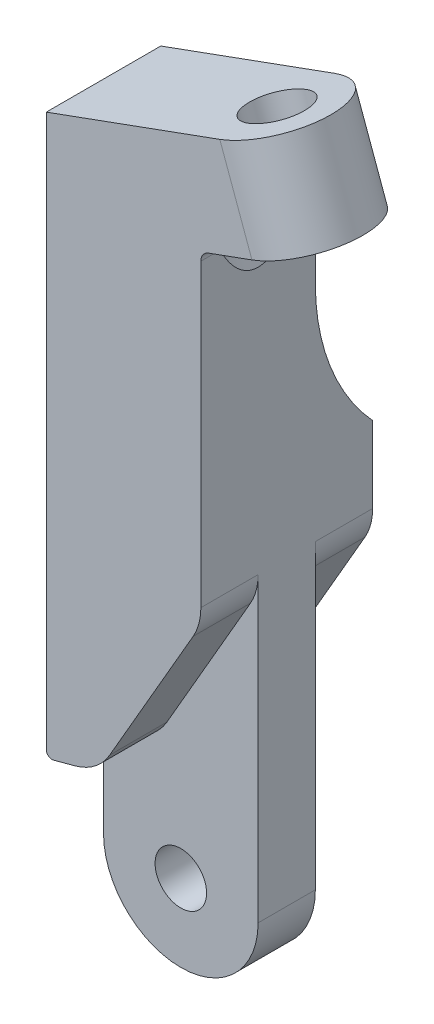
ISO-10303-21;
HEADER;
FILE_DESCRIPTION(('STEP AP214'),'2;1');
FILE_NAME('part.step','',(''),(''),'','','');
FILE_SCHEMA(('AUTOMOTIVE_DESIGN { 1 0 10303 214 1 1 1 1 }'));
ENDSEC;
DATA;
#1=APPLICATION_CONTEXT('core data for automotive mechanical design processes');
#2=APPLICATION_PROTOCOL_DEFINITION('international standard','automotive_design',2000,#1);
#3=PRODUCT_CONTEXT('',#1,'mechanical');
#4=PRODUCT('Part','Part','',(#3));
#5=PRODUCT_RELATED_PRODUCT_CATEGORY('part','',(#4));
#6=PRODUCT_DEFINITION_FORMATION('','',#4);
#7=PRODUCT_DEFINITION_CONTEXT('part definition',#1,'design');
#8=PRODUCT_DEFINITION('design','',#6,#7);
#9=PRODUCT_DEFINITION_SHAPE('','',#8);
#10=(LENGTH_UNIT() NAMED_UNIT(*) SI_UNIT(.MILLI.,.METRE.));
#11=(NAMED_UNIT(*) PLANE_ANGLE_UNIT() SI_UNIT($,.RADIAN.));
#12=(NAMED_UNIT(*) SI_UNIT($,.STERADIAN.) SOLID_ANGLE_UNIT());
#13=UNCERTAINTY_MEASURE_WITH_UNIT(LENGTH_MEASURE(1.E-05),#10,'distance_accuracy_value','');
#14=(GEOMETRIC_REPRESENTATION_CONTEXT(3) GLOBAL_UNCERTAINTY_ASSIGNED_CONTEXT((#13)) GLOBAL_UNIT_ASSIGNED_CONTEXT((#10,
#11,#12)) REPRESENTATION_CONTEXT('',''));
#15=CARTESIAN_POINT('',(0.,0.,0.));
#16=DIRECTION('',(0.,0.,1.));
#17=DIRECTION('',(1.,0.,0.));
#18=AXIS2_PLACEMENT_3D('',#15,#16,#17);
#19=CARTESIAN_POINT('',(7.74999998813417,52.5497924736561,-32.7119853821203));
#20=DIRECTION('',(0.,0.,1.));
#21=DIRECTION('',(1.,0.,0.));
#22=AXIS2_PLACEMENT_3D('',#19,#20,#21);
#23=CYLINDRICAL_SURFACE('',#22,1.);
#24=CARTESIAN_POINT('',(6.74999998813417,52.5497924736561,-0.833415067240527));
#25=CARTESIAN_POINT('',(6.7500121259237,52.5801881055409,-0.848996346004011));
#26=CARTESIAN_POINT('',(6.75138532953765,52.6098132825764,-0.865929051600248));
#27=CARTESIAN_POINT('',(6.75652244711346,52.6674473197246,-0.901856011982591));
#28=CARTESIAN_POINT('',(6.76027864759318,52.6954610778992,-0.920843451968727));
#29=CARTESIAN_POINT('',(6.76981116623183,52.7497451059245,-0.96016730730305));
#30=CARTESIAN_POINT('',(6.77556885288268,52.7760288846872,-0.980489925414612));
#31=CARTESIAN_POINT('',(6.78889147869522,52.8272288596915,-1.02227969994567));
#32=CARTESIAN_POINT('',(6.79645835456583,52.8521435549584,-1.04374806360577));
#33=CARTESIAN_POINT('',(6.81706092657832,52.9117677614023,-1.0975468507032));
#34=CARTESIAN_POINT('',(6.83101409580388,52.9457371950115,-1.13034887720623));
#35=CARTESIAN_POINT('',(6.86200385507355,53.0110618209416,-1.19709522197321));
#36=CARTESIAN_POINT('',(6.87904319408747,53.0424146458819,-1.23104053648487));
#37=CARTESIAN_POINT('',(6.93468580892116,53.1331738362366,-1.33441242655575));
#38=CARTESIAN_POINT('',(6.9776369454426,53.188794590026,-1.40491920946501));
#39=CARTESIAN_POINT('',(7.05195280838462,53.2668519845086,-1.51404942511004));
#40=CARTESIAN_POINT('',(7.07974464497137,53.2929023776563,-1.55263851979391));
#41=CARTESIAN_POINT('',(7.13830036682305,53.3418019363935,-1.62960848721527));
#42=CARTESIAN_POINT('',(7.16906386461265,53.3646515183877,-1.66798938641198));
#43=CARTESIAN_POINT('',(7.23300195249108,53.4066214512343,-1.74371260716944));
#44=CARTESIAN_POINT('',(7.26613698443743,53.4257893184443,-1.78106194847892));
#45=CARTESIAN_POINT('',(7.33508368740728,53.4604673280668,-1.8550148836149));
#46=CARTESIAN_POINT('',(7.37089671476066,53.4759756002455,-1.89161808743645));
#47=CARTESIAN_POINT('',(7.40797984480851,53.489485094442,-1.92770279581762));
#48=B_SPLINE_CURVE_WITH_KNOTS('',3,(#24,#25,#26,#27,#28,#29,#30,#31,#32,#33,#34,#35,#36,#37,#38,
#39,#40,#41,#42,#43,#44,#45,#46,#47),.UNSPECIFIED.,.F.,.F.,(4,2,2,2,2,2,2,2,2,2,2,4),(0.,
0.102308288391796,0.204287094769039,0.305340951551447,0.406503473106495,0.553997630574197,
0.701623818702294,0.998922402218,1.16146236621537,1.3239811651378,1.48423597142556,
1.64457249931849),.UNSPECIFIED.);
#49=CARTESIAN_POINT('',(6.74999998813417,52.5497924736561,-0.833415067240533));
#50=VERTEX_POINT('',#49);
#51=CARTESIAN_POINT('',(7.40797984480851,53.489485094442,-1.92770279581762));
#52=VERTEX_POINT('',#51);
#53=EDGE_CURVE('E11',#50,#52,#48,.T.);
#54=ORIENTED_EDGE('',*,*,#53,.F.);
#55=DIRECTION('',(0.,0.,-1.));
#56=VECTOR('',#55,1.);
#57=CARTESIAN_POINT('',(6.74999998813417,52.5497924736561,7.5));
#58=LINE('',#57,#56);
#59=CARTESIAN_POINT('',(6.74999998813417,52.5497924736561,-2.5));
#60=VERTEX_POINT('',#59);
#61=EDGE_CURVE('E237',#60,#50,#58,.F.);
#62=ORIENTED_EDGE('',*,*,#61,.F.);
#63=CARTESIAN_POINT('',(7.74999998813417,52.5497924736561,-2.5));
#64=DIRECTION('',(0.,0.,-1.));
#65=DIRECTION('',(-1.,0.,0.));
#66=AXIS2_PLACEMENT_3D('',#63,#64,#65);
#67=CIRCLE('',#66,1.);
#68=CARTESIAN_POINT('',(7.40797984480851,53.489485094442,-2.5));
#69=VERTEX_POINT('',#68);
#70=EDGE_CURVE('E244',#69,#60,#67,.F.);
#71=ORIENTED_EDGE('',*,*,#70,.F.);
#72=DIRECTION('',(0.,0.,-1.));
#73=VECTOR('',#72,1.);
#74=CARTESIAN_POINT('',(7.40797984480851,53.489485094442,-2.5));
#75=LINE('',#74,#73);
#76=EDGE_CURVE('E235',#52,#69,#75,.T.);
#77=ORIENTED_EDGE('',*,*,#76,.F.);
#78=EDGE_LOOP('',(#54,#62,#71,#77));
#79=FACE_BOUND('',#78,.T.);
#80=ADVANCED_FACE('F47',(#79),#23,.F.);
#81=CARTESIAN_POINT('',(7.40797984480851,53.489485094442,6.92770279581763));
#82=CARTESIAN_POINT('',(7.37111802664098,53.4760564732943,6.89183325416589));
#83=CARTESIAN_POINT('',(7.33551136745503,53.460652607839,6.85545183291901));
#84=CARTESIAN_POINT('',(7.26694596281548,53.4262255994286,6.78195101237226));
#85=CARTESIAN_POINT('',(7.23398579136246,53.4072044244447,6.74483202412844));
#86=CARTESIAN_POINT('',(7.1702565357663,53.3654960556809,6.66944682912296));
#87=CARTESIAN_POINT('',(7.13953603675883,53.3427503999884,6.63117192047675));
#88=CARTESIAN_POINT('',(7.08105013706451,53.2940724348632,6.5544128703692));
#89=CARTESIAN_POINT('',(7.05328524336279,53.268139580358,6.51592869419765));
#90=CARTESIAN_POINT('',(6.97407575066921,53.1852723161706,6.39983969510032));
#91=CARTESIAN_POINT('',(6.92726377375148,53.12363003714,6.32225049663843));
#92=CARTESIAN_POINT('',(6.8678281579917,53.0223173420576,6.20905509883653));
#93=CARTESIAN_POINT('',(6.8498697069844,52.9872470371154,6.17201262495571));
#94=CARTESIAN_POINT('',(6.81778035467151,52.9138950139586,6.09948873288498));
#95=CARTESIAN_POINT('',(6.80364706904174,52.8756153158243,6.06400635385505));
#96=CARTESIAN_POINT('',(6.77884182558577,52.7924429251857,5.99286206777188));
#97=CARTESIAN_POINT('',(6.7685209520068,52.7472678956732,5.95739743029305));
#98=CARTESIAN_POINT('',(6.75770897384327,52.676044665088,5.90773374375977));
#99=CARTESIAN_POINT('',(6.75488137931062,52.6516217906914,5.8917109933657));
#100=CARTESIAN_POINT('',(6.7510276047904,52.6015896896537,5.86125662933187));
#101=CARTESIAN_POINT('',(6.75000594687355,52.5759776492697,5.84682909446958));
#102=CARTESIAN_POINT('',(6.74999998813417,52.5497924736561,5.83341506724053));
#103=B_SPLINE_CURVE_WITH_KNOTS('',3,(#81,#82,#83,#84,#85,#86,#87,#88,#89,#90,#91,#92,#93,#94,
#95,#96,#97,#98,#99,#100,#101,#102),.UNSPECIFIED.,.F.,.F.,(4,2,2,2,2,2,2,2,2,2,4),(0.,
0.159379851145446,0.318673239609046,0.4807612629487,0.642877045153127,0.96985448386189,
1.13190670104353,1.29385767304079,1.46830085922627,1.5562307285583,1.64438046430672),.UNSPECIFIED.);
#104=CARTESIAN_POINT('',(7.40797984480851,53.489485094442,6.92770279581762));
#105=VERTEX_POINT('',#104);
#106=CARTESIAN_POINT('',(6.74999998813417,52.5497924736561,5.83341506724053));
#107=VERTEX_POINT('',#106);
#108=EDGE_CURVE('E60',#105,#107,#103,.T.);
#109=ORIENTED_EDGE('',*,*,#108,.F.);
#110=CARTESIAN_POINT('',(7.40797984480851,53.489485094442,7.5));
#111=VERTEX_POINT('',#110);
#112=EDGE_CURVE('E228',#111,#105,#75,.T.);
#113=ORIENTED_EDGE('',*,*,#112,.F.);
#114=CARTESIAN_POINT('',(7.74999998813417,52.5497924736561,7.5));
#115=DIRECTION('',(0.,0.,1.));
#116=DIRECTION('',(1.,0.,0.));
#117=AXIS2_PLACEMENT_3D('',#114,#115,#116);
#118=CIRCLE('',#117,1.);
#119=CARTESIAN_POINT('',(6.74999998813417,52.5497924736561,7.5));
#120=VERTEX_POINT('',#119);
#121=EDGE_CURVE('E229',#120,#111,#118,.F.);
#122=ORIENTED_EDGE('',*,*,#121,.F.);
#123=EDGE_CURVE('E74',#107,#120,#58,.F.);
#124=ORIENTED_EDGE('',*,*,#123,.F.);
#125=EDGE_LOOP('',(#109,#113,#122,#124));
#126=FACE_BOUND('',#125,.T.);
#127=ADVANCED_FACE('F226',(#126),#23,.F.);
#128=CARTESIAN_POINT('',(-19.1329023260968,52.5672171095828,-32.7119853821203));
#129=DIRECTION('',(0.342020143325663,-0.93969262078591,0.));
#130=DIRECTION('',(0.93969262078591,0.342020143325663,0.));
#131=AXIS2_PLACEMENT_3D('',#128,#129,#130);
#132=PLANE('',#131);
#133=DIRECTION('',(0.93969262078591,0.342020143325663,0.));
#134=VECTOR('',#133,1.);
#135=CARTESIAN_POINT('',(-19.1329023260968,52.5672171095828,7.5));
#136=LINE('',#135,#134);
#137=CARTESIAN_POINT('',(-6.74999998813418,57.0742249744265,7.5));
#138=VERTEX_POINT('',#137);
#139=CARTESIAN_POINT('',(8.40463453535648,62.59006085216,7.5));
#140=VERTEX_POINT('',#139);
#141=EDGE_CURVE('E401',#138,#140,#136,.T.);
#142=ORIENTED_EDGE('',*,*,#141,.T.);
#143=CARTESIAN_POINT('',(8.40463453535648,62.59006085216,2.5));
#144=DIRECTION('',(0.342020143325663,-0.93969262078591,0.));
#145=DIRECTION('',(0.93969262078591,0.342020143325663,0.));
#146=AXIS2_PLACEMENT_3D('',#143,#144,#145);
#147=CIRCLE('',#146,5.);
#148=CARTESIAN_POINT('',(8.40463453535648,62.59006085216,-2.5));
#149=VERTEX_POINT('',#148);
#150=EDGE_CURVE('E476',#140,#149,#147,.F.);
#151=ORIENTED_EDGE('',*,*,#150,.T.);
#152=DIRECTION('',(-0.93969262078591,-0.342020143325664,0.));
#153=VECTOR('',#152,1.);
#154=CARTESIAN_POINT('',(-19.1329023260968,52.5672171095828,-2.5));
#155=LINE('',#154,#153);
#156=CARTESIAN_POINT('',(-6.74999998813418,57.0742249744265,-2.5));
#157=VERTEX_POINT('',#156);
#158=EDGE_CURVE('E385',#149,#157,#155,.T.);
#159=ORIENTED_EDGE('',*,*,#158,.T.);
#160=DIRECTION('',(0.,0.,1.));
#161=VECTOR('',#160,1.);
#162=CARTESIAN_POINT('',(-6.74999998813418,57.0742249744265,-32.7119853821203));
#163=LINE('',#162,#161);
#164=EDGE_CURVE('E404',#157,#138,#163,.T.);
#165=ORIENTED_EDGE('',*,*,#164,.T.);
#166=EDGE_LOOP('',(#142,#151,#159,#165));
#167=FACE_BOUND('',#166,.T.);
#168=CARTESIAN_POINT('',(8.40463453535648,62.59006085216,2.5));
#169=DIRECTION('',(-0.342020143325664,0.93969262078591,0.));
#170=DIRECTION('',(-0.93969262078591,-0.342020143325664,0.));
#171=AXIS2_PLACEMENT_3D('',#168,#169,#170);
#172=CIRCLE('',#171,2.5527);
#173=CARTESIAN_POINT('',(6.00588118227628,61.7169860322926,2.5));
#174=VERTEX_POINT('',#173);
#175=EDGE_CURVE('E586',#174,#174,#172,.T.);
#176=ORIENTED_EDGE('',*,*,#175,.F.);
#177=EDGE_LOOP('',(#176));
#178=FACE_BOUND('',#177,.T.);
#179=ADVANCED_FACE('F267',(#167,#178),#132,.F.);
#180=CARTESIAN_POINT('',(11.2129167528212,54.8743688722195,2.5));
#181=DIRECTION('',(0.342020143325663,-0.939692620785911,0.));
#182=DIRECTION('',(0.939692620785911,0.342020143325663,0.));
#183=AXIS2_PLACEMENT_3D('',#180,#181,#182);
#184=CYLINDRICAL_SURFACE('',#183,5.);
#185=DIRECTION('',(-0.342020143325663,0.939692620785911,0.));
#186=VECTOR('',#185,1.);
#187=CARTESIAN_POINT('',(11.2129167528212,54.8743688722195,7.5));
#188=LINE('',#187,#186);
#189=CARTESIAN_POINT('',(11.2129167528212,54.8743688722195,7.5));
#190=VERTEX_POINT('',#189);
#191=EDGE_CURVE('E483',#190,#140,#188,.T.);
#192=ORIENTED_EDGE('',*,*,#191,.F.);
#193=CARTESIAN_POINT('',(11.2129167528212,54.8743688722195,2.5));
#194=DIRECTION('',(-0.342020143325663,0.93969262078591,0.));
#195=DIRECTION('',(-0.93969262078591,-0.342020143325663,0.));
#196=AXIS2_PLACEMENT_3D('',#193,#194,#195);
#197=CIRCLE('',#196,5.);
#198=CARTESIAN_POINT('',(11.2129167528212,54.8743688722195,-2.5));
#199=VERTEX_POINT('',#198);
#200=EDGE_CURVE('E482',#199,#190,#197,.F.);
#201=ORIENTED_EDGE('',*,*,#200,.F.);
#202=DIRECTION('',(-0.342020143325663,0.939692620785911,0.));
#203=VECTOR('',#202,1.);
#204=CARTESIAN_POINT('',(11.2129167528212,54.8743688722195,-2.5));
#205=LINE('',#204,#203);
#206=EDGE_CURVE('E480',#149,#199,#205,.F.);
#207=ORIENTED_EDGE('',*,*,#206,.F.);
#208=ORIENTED_EDGE('',*,*,#150,.F.);
#209=EDGE_LOOP('',(#192,#201,#207,#208));
#210=FACE_BOUND('',#209,.T.);
#211=ADVANCED_FACE('F270',(#210),#184,.T.);
#212=CARTESIAN_POINT('',(6.74999998813417,0.,7.5));
#213=DIRECTION('',(-1.,0.,0.));
#214=DIRECTION('',(0.,0.,1.));
#215=AXIS2_PLACEMENT_3D('',#212,#213,#214);
#216=PLANE('',#215);
#217=CARTESIAN_POINT('',(6.74999998813417,67.1361319081029,2.5));
#218=DIRECTION('',(-1.,0.,0.));
#219=DIRECTION('',(0.,1.,0.));
#220=AXIS2_PLACEMENT_3D('',#217,#218,#219);
#221=ELLIPSE('',#220,17.5428264009788,6.);
#222=EDGE_CURVE('E222',#107,#50,#221,.F.);
#223=ORIENTED_EDGE('',*,*,#222,.F.);
#224=ORIENTED_EDGE('',*,*,#123,.T.);
#225=DIRECTION('',(0.,1.,0.));
#226=VECTOR('',#225,1.);
#227=CARTESIAN_POINT('',(6.74999998813417,0.,7.5));
#228=LINE('',#227,#226);
#229=CARTESIAN_POINT('',(6.74999998813417,26.3397459621556,7.5));
#230=VERTEX_POINT('',#229);
#231=EDGE_CURVE('E445',#230,#120,#228,.T.);
#232=ORIENTED_EDGE('',*,*,#231,.F.);
#233=DIRECTION('',(0.,0.,1.));
#234=VECTOR('',#233,1.);
#235=CARTESIAN_POINT('',(6.74999998813417,26.3397459621556,7.5));
#236=LINE('',#235,#234);
#237=CARTESIAN_POINT('',(6.74999998813417,26.3397459621556,2.5));
#238=VERTEX_POINT('',#237);
#239=EDGE_CURVE('E539',#230,#238,#236,.F.);
#240=ORIENTED_EDGE('',*,*,#239,.T.);
#241=DIRECTION('',(0.,1.,0.));
#242=VECTOR('',#241,1.);
#243=CARTESIAN_POINT('',(6.74999998813417,0.,2.5));
#244=LINE('',#243,#242);
#245=CARTESIAN_POINT('',(6.74999998813417,0.,2.5));
#246=VERTEX_POINT('',#245);
#247=EDGE_CURVE('E431',#246,#238,#244,.T.);
#248=ORIENTED_EDGE('',*,*,#247,.F.);
#249=DIRECTION('',(0.,0.,-1.));
#250=VECTOR('',#249,1.);
#251=CARTESIAN_POINT('',(6.74999998813417,0.,7.5));
#252=LINE('',#251,#250);
#253=CARTESIAN_POINT('',(6.74999998813417,0.,-2.5));
#254=VERTEX_POINT('',#253);
#255=EDGE_CURVE('E457',#246,#254,#252,.T.);
#256=ORIENTED_EDGE('',*,*,#255,.T.);
#257=DIRECTION('',(0.,1.,0.));
#258=VECTOR('',#257,1.);
#259=CARTESIAN_POINT('',(6.74999998813417,0.,-2.5));
#260=LINE('',#259,#258);
#261=CARTESIAN_POINT('',(6.74999998813417,26.3397459621556,-2.5));
#262=VERTEX_POINT('',#261);
#263=EDGE_CURVE('E419',#254,#262,#260,.T.);
#264=ORIENTED_EDGE('',*,*,#263,.T.);
#265=DIRECTION('',(0.,0.,-1.));
#266=VECTOR('',#265,1.);
#267=CARTESIAN_POINT('',(6.74999998813417,26.3397459621556,-7.5));
#268=LINE('',#267,#266);
#269=CARTESIAN_POINT('',(6.74999998813417,26.3397459621556,-7.5));
#270=VERTEX_POINT('',#269);
#271=EDGE_CURVE('E540',#262,#270,#268,.T.);
#272=ORIENTED_EDGE('',*,*,#271,.T.);
#273=DIRECTION('',(0.,1.,0.));
#274=VECTOR('',#273,1.);
#275=CARTESIAN_POINT('',(6.74999998813417,0.,-7.5));
#276=LINE('',#275,#274);
#277=CARTESIAN_POINT('',(6.74999998813417,33.,-7.5));
#278=VERTEX_POINT('',#277);
#279=EDGE_CURVE('E441',#270,#278,#276,.T.);
#280=ORIENTED_EDGE('',*,*,#279,.T.);
#281=CARTESIAN_POINT('',(6.74999998813417,45.8452325786651,-21.5));
#282=DIRECTION('',(-1.,0.,0.));
#283=DIRECTION('',(0.,0.,1.));
#284=AXIS2_PLACEMENT_3D('',#281,#282,#283);
#285=CIRCLE('',#284,19.);
#286=CARTESIAN_POINT('',(6.74999998813417,45.8452325786651,-2.5));
#287=VERTEX_POINT('',#286);
#288=EDGE_CURVE('E326',#278,#287,#285,.T.);
#289=ORIENTED_EDGE('',*,*,#288,.T.);
#290=DIRECTION('',(0.,1.,0.));
#291=VECTOR('',#290,1.);
#292=CARTESIAN_POINT('',(6.74999998813417,0.,-2.5));
#293=LINE('',#292,#291);
#294=EDGE_CURVE('E379',#287,#60,#293,.T.);
#295=ORIENTED_EDGE('',*,*,#294,.T.);
#296=ORIENTED_EDGE('',*,*,#61,.T.);
#297=EDGE_LOOP('',(#223,#224,#232,#240,#248,#256,#264,#272,#280,#289,#295,#296));
#298=FACE_BOUND('',#297,.T.);
#299=ADVANCED_FACE('F314',(#298),#216,.F.);
#300=CARTESIAN_POINT('',(-6.74999998813418,0.,7.5));
#301=DIRECTION('',(1.,0.,0.));
#302=DIRECTION('',(0.,0.,-1.));
#303=AXIS2_PLACEMENT_3D('',#300,#301,#302);
#304=PLANE('',#303);
#305=DIRECTION('',(0.,-1.,0.));
#306=VECTOR('',#305,1.);
#307=CARTESIAN_POINT('',(-6.74999998813418,0.,-7.5));
#308=LINE('',#307,#306);
#309=CARTESIAN_POINT('',(-6.74999998813418,16.6173141389246,-7.5));
#310=VERTEX_POINT('',#309);
#311=CARTESIAN_POINT('',(-6.74999998813418,8.85738409346512,-7.5));
#312=VERTEX_POINT('',#311);
#313=EDGE_CURVE('E448',#310,#312,#308,.T.);
#314=ORIENTED_EDGE('',*,*,#313,.T.);
#315=DIRECTION('',(0.,0.,-1.));
#316=VECTOR('',#315,1.);
#317=CARTESIAN_POINT('',(-6.74999998813418,8.85738409346512,-2.5));
#318=LINE('',#317,#316);
#319=CARTESIAN_POINT('',(-6.74999998813418,8.85738409346512,-2.5));
#320=VERTEX_POINT('',#319);
#321=EDGE_CURVE('E572',#312,#320,#318,.F.);
#322=ORIENTED_EDGE('',*,*,#321,.T.);
#323=DIRECTION('',(0.,-1.,0.));
#324=VECTOR('',#323,1.);
#325=CARTESIAN_POINT('',(-6.74999998813417,0.,-2.5));
#326=LINE('',#325,#324);
#327=CARTESIAN_POINT('',(-6.74999998813417,0.,-2.5));
#328=VERTEX_POINT('',#327);
#329=EDGE_CURVE('E410',#320,#328,#326,.T.);
#330=ORIENTED_EDGE('',*,*,#329,.T.);
#331=DIRECTION('',(0.,0.,-1.));
#332=VECTOR('',#331,1.);
#333=CARTESIAN_POINT('',(-6.74999998813418,0.,7.5));
#334=LINE('',#333,#332);
#335=CARTESIAN_POINT('',(-6.74999998813417,0.,2.5));
#336=VERTEX_POINT('',#335);
#337=EDGE_CURVE('E451',#336,#328,#334,.T.);
#338=ORIENTED_EDGE('',*,*,#337,.F.);
#339=DIRECTION('',(0.,-1.,0.));
#340=VECTOR('',#339,1.);
#341=CARTESIAN_POINT('',(-6.74999998813417,0.,2.5));
#342=LINE('',#341,#340);
#343=CARTESIAN_POINT('',(-6.74999998813418,8.85738409346512,2.5));
#344=VERTEX_POINT('',#343);
#345=EDGE_CURVE('E439',#344,#336,#342,.T.);
#346=ORIENTED_EDGE('',*,*,#345,.F.);
#347=DIRECTION('',(0.,0.,1.));
#348=VECTOR('',#347,1.);
#349=CARTESIAN_POINT('',(-6.74999998813418,8.85738409346512,7.5));
#350=LINE('',#349,#348);
#351=CARTESIAN_POINT('',(-6.74999998813418,8.85738409346512,7.5));
#352=VERTEX_POINT('',#351);
#353=EDGE_CURVE('E566',#344,#352,#350,.T.);
#354=ORIENTED_EDGE('',*,*,#353,.T.);
#355=DIRECTION('',(0.,-1.,0.));
#356=VECTOR('',#355,1.);
#357=CARTESIAN_POINT('',(-6.74999998813418,0.,7.5));
#358=LINE('',#357,#356);
#359=EDGE_CURVE('E447',#138,#352,#358,.T.);
#360=ORIENTED_EDGE('',*,*,#359,.F.);
#361=ORIENTED_EDGE('',*,*,#164,.F.);
#362=DIRECTION('',(0.,-1.,0.));
#363=VECTOR('',#362,1.);
#364=CARTESIAN_POINT('',(-6.74999998813418,0.,-2.5));
#365=LINE('',#364,#363);
#366=CARTESIAN_POINT('',(-6.74999998813418,41.5378828490597,-2.5));
#367=VERTEX_POINT('',#366);
#368=EDGE_CURVE('E395',#157,#367,#365,.T.);
#369=ORIENTED_EDGE('',*,*,#368,.T.);
#370=CARTESIAN_POINT('',(-6.74999998813418,41.5378828490597,-2.5));
#371=CARTESIAN_POINT('',(-6.74999998813418,41.2491165298098,-2.49998091824061));
#372=CARTESIAN_POINT('',(-6.74999998813418,40.9603712015682,-2.50312326740385));
#373=CARTESIAN_POINT('',(-6.74999998813418,40.3831054571376,-2.51469702722399));
#374=CARTESIAN_POINT('',(-6.74999998813418,40.0945849974656,-2.5231262028281));
#375=CARTESIAN_POINT('',(-6.74999998813418,39.5177582067117,-2.5442396982033));
#376=CARTESIAN_POINT('',(-6.74999998813418,39.2294518470303,-2.55692327446328));
#377=CARTESIAN_POINT('',(-6.74999998813418,38.6529366451138,-2.58538435276485));
#378=CARTESIAN_POINT('',(-6.74999998813418,38.3647278345137,-2.60116248174703));
#379=CARTESIAN_POINT('',(-6.74999998813418,37.4987172665001,-2.651361463617));
#380=CARTESIAN_POINT('',(-6.74999998813418,36.92108375109,-2.68857693843558));
#381=CARTESIAN_POINT('',(-6.74999998813418,36.0544643155708,-2.74191412983767));
#382=CARTESIAN_POINT('',(-6.74999998813418,35.7655545252714,-2.75927932830935));
#383=CARTESIAN_POINT('',(-6.74999998813418,35.187614860974,-2.7918540930649));
#384=CARTESIAN_POINT('',(-6.74999998813418,34.8985849891468,-2.80706369675028));
#385=CARTESIAN_POINT('',(-6.74999998813418,34.3204012848107,-2.83413472892164));
#386=CARTESIAN_POINT('',(-6.74999998813418,34.0312474728018,-2.84599658399473));
#387=CARTESIAN_POINT('',(-6.74999998813418,33.4527927473112,-2.86541195418722));
#388=CARTESIAN_POINT('',(-6.74999998813418,33.1634918346438,-2.87296549290439));
#389=CARTESIAN_POINT('',(-6.74999998813418,32.5848522902932,-2.88313353470876));
#390=CARTESIAN_POINT('',(-6.74999998813418,32.2955136745007,-2.88574891707634));
#391=CARTESIAN_POINT('',(-6.74999998813418,31.7168356853914,-2.88582176923653));
#392=CARTESIAN_POINT('',(-6.74999998813418,31.4274963120744,-2.88327923754801));
#393=CARTESIAN_POINT('',(-6.74999998813418,30.8493831443333,-2.87325996043018));
#394=CARTESIAN_POINT('',(-6.74999998813418,30.5606092045904,-2.86579136540631));
#395=CARTESIAN_POINT('',(-6.74999998813418,29.983207592543,-2.84654890436829));
#396=CARTESIAN_POINT('',(-6.74999998813418,29.6945799208557,-2.83477502033642));
#397=CARTESIAN_POINT('',(-6.74999998813418,29.11739560889,-2.80786995216538));
#398=CARTESIAN_POINT('',(-6.74999998813418,28.8288390184057,-2.79273772789397));
#399=CARTESIAN_POINT('',(-6.74999998813418,28.2518486497837,-2.76030154836894));
#400=CARTESIAN_POINT('',(-6.74999998813418,27.9634148727292,-2.74299757434217));
#401=CARTESIAN_POINT('',(-6.74999998813418,27.3857191360901,-2.70747562846063));
#402=CARTESIAN_POINT('',(-6.74999998813418,27.0964573422326,-2.68925502250118));
#403=CARTESIAN_POINT('',(-6.74999998813418,26.517908819026,-2.65331142038654));
#404=CARTESIAN_POINT('',(-6.74999998813418,26.228622090355,-2.63558841342992));
#405=CARTESIAN_POINT('',(-6.74999998813418,25.650089566691,-2.60199117968632));
#406=CARTESIAN_POINT('',(-6.74999998813418,25.3608438302951,-2.5861159847228));
#407=CARTESIAN_POINT('',(-6.74999998813418,24.7821788946308,-2.55744814896371));
#408=CARTESIAN_POINT('',(-6.74999998813418,24.4927596834408,-2.54465575235338));
#409=CARTESIAN_POINT('',(-6.74999998813418,24.2032455228381,-2.53402843716576));
#410=B_SPLINE_CURVE_WITH_KNOTS('',3,(#370,#371,#372,#373,#374,#375,#376,#377,#378,#379,#380,
#381,#382,#383,#384,#385,#386,#387,#388,#389,#390,#391,#392,#393,#394,#395,#396,#397,#398,#399,
#400,#401,#402,#403,#404,#405,#406,#407,#408,#409),.UNSPECIFIED.,.F.,.F.,(4,2,2,2,2,2,2,2,2,2,2,
2,2,2,2,2,2,2,2,4),(0.,0.86625134064839,1.73213671246899,2.59787083848497,3.46378053932936,
5.20026128124612,6.06855243854729,6.93682852836764,7.80499392804355,8.67315457251034,
9.54116061906979,10.4091669148809,11.2757406436741,12.1423179991406,13.0091641231012,
13.8760177408064,14.7455231784282,15.6150097269863,16.4840386302552,17.3531363457892),.UNSPECIFIED.);
#411=CARTESIAN_POINT('',(-6.74999998813418,37.7942286203585,-2.63450331758984));
#412=VERTEX_POINT('',#411);
#413=EDGE_CURVE('E318',#367,#412,#410,.T.);
#414=ORIENTED_EDGE('',*,*,#413,.T.);
#415=CARTESIAN_POINT('',(-6.74999998813418,42.3077792962549,-21.5));
#416=DIRECTION('',(1.,0.,0.));
#417=DIRECTION('',(0.,1.,0.));
#418=AXIS2_PLACEMENT_3D('',#415,#416,#417);
#419=ELLIPSE('',#418,38.,19.);
#420=EDGE_CURVE('E564',#412,#310,#419,.T.);
#421=ORIENTED_EDGE('',*,*,#420,.T.);
#422=EDGE_LOOP('',(#314,#322,#330,#338,#346,#354,#360,#361,#369,#414,#421));
#423=FACE_BOUND('',#422,.T.);
#424=ADVANCED_FACE('F309',(#423),#304,.F.);
#425=CARTESIAN_POINT('',(0.,0.,-7.5));
#426=DIRECTION('',(0.,0.,1.));
#427=DIRECTION('',(1.,0.,0.));
#428=AXIS2_PLACEMENT_3D('',#425,#426,#427);
#429=PLANE('',#428);
#430=DIRECTION('',(-0.500000000000001,-0.866025403784438,0.));
#431=VECTOR('',#430,1.);
#432=CARTESIAN_POINT('',(-2.24999998813418,9.41154277298456,-7.5));
#433=LINE('',#432,#431);
#434=CARTESIAN_POINT('',(6.08012700705636,23.8397459621556,-7.5));
#435=VERTEX_POINT('',#434);
#436=CARTESIAN_POINT('',(-1.21446608220144,11.2051401110203,-7.5));
#437=VERTEX_POINT('',#436);
#438=EDGE_CURVE('E411',#435,#437,#433,.T.);
#439=ORIENTED_EDGE('',*,*,#438,.T.);
#440=CARTESIAN_POINT('',(-5.54459310112363,13.7051401110203,-7.5));
#441=DIRECTION('',(0.,0.,1.));
#442=DIRECTION('',(1.,0.,0.));
#443=AXIS2_PLACEMENT_3D('',#440,#441,#442);
#444=CIRCLE('',#443,5.);
#445=CARTESIAN_POINT('',(-4.25049787561104,8.87551097957498,-7.5));
#446=VERTEX_POINT('',#445);
#447=EDGE_CURVE('E495',#437,#446,#444,.F.);
#448=ORIENTED_EDGE('',*,*,#447,.T.);
#449=DIRECTION('',(-0.965925826289069,-0.258819045102518,0.));
#450=VECTOR('',#449,1.);
#451=CARTESIAN_POINT('',(-6.74999998813418,8.20577140704452,-7.5));
#452=LINE('',#451,#450);
#453=CARTESIAN_POINT('',(-6.12059046558292,8.37442118032059,-7.5));
#454=VERTEX_POINT('',#453);
#455=EDGE_CURVE('E406',#446,#454,#452,.T.);
#456=ORIENTED_EDGE('',*,*,#455,.T.);
#457=CARTESIAN_POINT('',(-6.24999998813418,8.85738409346512,-7.5));
#458=DIRECTION('',(0.,0.,1.));
#459=DIRECTION('',(1.,0.,0.));
#460=AXIS2_PLACEMENT_3D('',#457,#458,#459);
#461=CIRCLE('',#460,0.5);
#462=EDGE_CURVE('E563',#454,#312,#461,.F.);
#463=ORIENTED_EDGE('',*,*,#462,.T.);
#464=ORIENTED_EDGE('',*,*,#313,.F.);
#465=DIRECTION('',(0.5,0.866025403784439,0.));
#466=VECTOR('',#465,1.);
#467=CARTESIAN_POINT('',(-12.2580080845881,7.07716426736557,-7.5));
#468=LINE('',#467,#466);
#469=CARTESIAN_POINT('',(2.41987296921197,32.5,-7.5));
#470=VERTEX_POINT('',#469);
#471=EDGE_CURVE('E388',#310,#470,#468,.T.);
#472=ORIENTED_EDGE('',*,*,#471,.T.);
#473=CARTESIAN_POINT('',(3.28589837299641,32.,-7.5));
#474=DIRECTION('',(0.,0.,1.));
#475=DIRECTION('',(1.,0.,0.));
#476=AXIS2_PLACEMENT_3D('',#473,#474,#475);
#477=CIRCLE('',#476,1.);
#478=CARTESIAN_POINT('',(3.28589837299641,33.,-7.5));
#479=VERTEX_POINT('',#478);
#480=EDGE_CURVE('E460',#470,#479,#477,.F.);
#481=ORIENTED_EDGE('',*,*,#480,.T.);
#482=DIRECTION('',(1.,0.,0.));
#483=VECTOR('',#482,1.);
#484=CARTESIAN_POINT('',(0.,33.,-7.5));
#485=LINE('',#484,#483);
#486=EDGE_CURVE('E383',#479,#278,#485,.T.);
#487=ORIENTED_EDGE('',*,*,#486,.T.);
#488=ORIENTED_EDGE('',*,*,#279,.F.);
#489=CARTESIAN_POINT('',(1.74999998813417,26.3397459621556,-7.5));
#490=DIRECTION('',(0.,0.,1.));
#491=DIRECTION('',(1.,0.,0.));
#492=AXIS2_PLACEMENT_3D('',#489,#490,#491);
#493=CIRCLE('',#492,5.);
#494=EDGE_CURVE('E531',#270,#435,#493,.F.);
#495=ORIENTED_EDGE('',*,*,#494,.T.);
#496=EDGE_LOOP('',(#439,#448,#456,#463,#464,#472,#481,#487,#488,#495));
#497=FACE_BOUND('',#496,.T.);
#498=ADVANCED_FACE('F275',(#497),#429,.F.);
#499=CARTESIAN_POINT('',(-16.3246201086321,44.8515251296423,-32.7119853821203));
#500=DIRECTION('',(-0.342020143325663,0.93969262078591,0.));
#501=DIRECTION('',(-0.93969262078591,-0.342020143325663,0.));
#502=AXIS2_PLACEMENT_3D('',#499,#500,#501);
#503=PLANE('',#502);
#504=ORIENTED_EDGE('',*,*,#112,.T.);
#505=CARTESIAN_POINT('',(11.2129167528212,54.8743688722195,2.5));
#506=DIRECTION('',(0.342020143325663,-0.93969262078591,0.));
#507=DIRECTION('',(0.93969262078591,0.342020143325663,0.));
#508=AXIS2_PLACEMENT_3D('',#505,#506,#507);
#509=CIRCLE('',#508,6.);
#510=EDGE_CURVE('E67',#105,#52,#509,.T.);
#511=ORIENTED_EDGE('',*,*,#510,.T.);
#512=ORIENTED_EDGE('',*,*,#76,.T.);
#513=DIRECTION('',(0.93969262078591,0.342020143325664,0.));
#514=VECTOR('',#513,1.);
#515=CARTESIAN_POINT('',(-16.3246201086321,44.8515251296423,-2.5));
#516=LINE('',#515,#514);
#517=EDGE_CURVE('E382',#69,#199,#516,.T.);
#518=ORIENTED_EDGE('',*,*,#517,.T.);
#519=ORIENTED_EDGE('',*,*,#200,.T.);
#520=DIRECTION('',(-0.93969262078591,-0.342020143325663,0.));
#521=VECTOR('',#520,1.);
#522=CARTESIAN_POINT('',(-16.3246201086321,44.8515251296423,7.5));
#523=LINE('',#522,#521);
#524=EDGE_CURVE('E233',#190,#111,#523,.T.);
#525=ORIENTED_EDGE('',*,*,#524,.T.);
#526=EDGE_LOOP('',(#504,#511,#512,#518,#519,#525));
#527=FACE_BOUND('',#526,.T.);
#528=CARTESIAN_POINT('',(11.2129167528212,54.8743688722195,2.5));
#529=DIRECTION('',(-0.342020143325663,0.93969262078591,0.));
#530=DIRECTION('',(-0.93969262078591,-0.342020143325663,0.));
#531=AXIS2_PLACEMENT_3D('',#528,#529,#530);
#532=CIRCLE('',#531,2.5527);
#533=CARTESIAN_POINT('',(8.81416339974104,54.0012940523521,2.5));
#534=VERTEX_POINT('',#533);
#535=EDGE_CURVE('E391',#534,#534,#532,.T.);
#536=ORIENTED_EDGE('',*,*,#535,.T.);
#537=EDGE_LOOP('',(#536));
#538=FACE_BOUND('',#537,.T.);
#539=ADVANCED_FACE('F230',(#527,#538),#503,.F.);
#540=CARTESIAN_POINT('',(0.,0.,7.5));
#541=DIRECTION('',(0.,0.,-1.));
#542=DIRECTION('',(-1.,0.,0.));
#543=AXIS2_PLACEMENT_3D('',#540,#541,#542);
#544=CYLINDRICAL_SURFACE('',#543,6.74999998813418);
#545=CARTESIAN_POINT('',(0.,0.,-2.5));
#546=DIRECTION('',(0.,0.,1.));
#547=DIRECTION('',(1.,0.,0.));
#548=AXIS2_PLACEMENT_3D('',#545,#546,#547);
#549=CIRCLE('',#548,6.74999998813417);
#550=EDGE_CURVE('E407',#328,#254,#549,.T.);
#551=ORIENTED_EDGE('',*,*,#550,.T.);
#552=ORIENTED_EDGE('',*,*,#255,.F.);
#553=CARTESIAN_POINT('',(0.,0.,2.5));
#554=DIRECTION('',(0.,0.,1.));
#555=DIRECTION('',(1.,0.,0.));
#556=AXIS2_PLACEMENT_3D('',#553,#554,#555);
#557=CIRCLE('',#556,6.74999998813417);
#558=EDGE_CURVE('E429',#336,#246,#557,.T.);
#559=ORIENTED_EDGE('',*,*,#558,.F.);
#560=ORIENTED_EDGE('',*,*,#337,.T.);
#561=EDGE_LOOP('',(#551,#552,#559,#560));
#562=FACE_BOUND('',#561,.T.);
#563=ADVANCED_FACE('F274',(#562),#544,.T.);
#564=CARTESIAN_POINT('',(0.,0.,2.5));
#565=DIRECTION('',(0.,0.,1.));
#566=DIRECTION('',(1.,0.,0.));
#567=AXIS2_PLACEMENT_3D('',#564,#565,#566);
#568=CYLINDRICAL_SURFACE('',#567,2.24999999999999);
#569=CARTESIAN_POINT('',(0.,0.,2.5));
#570=DIRECTION('',(0.,0.,1.));
#571=DIRECTION('',(1.,0.,0.));
#572=AXIS2_PLACEMENT_3D('',#569,#570,#571);
#573=CIRCLE('',#572,2.24999999999999);
#574=CARTESIAN_POINT('',(2.24999999999999,0.,2.5));
#575=VERTEX_POINT('',#574);
#576=EDGE_CURVE('E425',#575,#575,#573,.T.);
#577=ORIENTED_EDGE('',*,*,#576,.T.);
#578=EDGE_LOOP('',(#577));
#579=FACE_BOUND('',#578,.T.);
#580=CARTESIAN_POINT('',(0.,0.,-2.5));
#581=DIRECTION('',(0.,0.,-1.));
#582=DIRECTION('',(-1.,0.,0.));
#583=AXIS2_PLACEMENT_3D('',#580,#581,#582);
#584=CIRCLE('',#583,2.24999999999999);
#585=CARTESIAN_POINT('',(-2.24999999999999,0.,-2.5));
#586=VERTEX_POINT('',#585);
#587=EDGE_CURVE('E421',#586,#586,#584,.F.);
#588=ORIENTED_EDGE('',*,*,#587,.F.);
#589=EDGE_LOOP('',(#588));
#590=FACE_BOUND('',#589,.T.);
#591=ADVANCED_FACE('F288',(#579,#590),#568,.F.);
#592=CARTESIAN_POINT('',(0.,0.,7.5));
#593=DIRECTION('',(0.,0.,1.));
#594=DIRECTION('',(1.,0.,0.));
#595=AXIS2_PLACEMENT_3D('',#592,#593,#594);
#596=PLANE('',#595);
#597=DIRECTION('',(-0.965925826289069,-0.258819045102518,0.));
#598=VECTOR('',#597,1.);
#599=CARTESIAN_POINT('',(-6.74999998813418,8.20577140704452,7.5));
#600=LINE('',#599,#598);
#601=CARTESIAN_POINT('',(-4.25049787561104,8.87551097957498,7.5));
#602=VERTEX_POINT('',#601);
#603=CARTESIAN_POINT('',(-6.12059046558292,8.37442118032059,7.5));
#604=VERTEX_POINT('',#603);
#605=EDGE_CURVE('E432',#602,#604,#600,.T.);
#606=ORIENTED_EDGE('',*,*,#605,.F.);
#607=CARTESIAN_POINT('',(-5.54459310112363,13.7051401110203,7.5));
#608=DIRECTION('',(0.,0.,1.));
#609=DIRECTION('',(1.,0.,0.));
#610=AXIS2_PLACEMENT_3D('',#607,#608,#609);
#611=CIRCLE('',#610,5.);
#612=CARTESIAN_POINT('',(-1.21446608220144,11.2051401110203,7.5));
#613=VERTEX_POINT('',#612);
#614=EDGE_CURVE('E502',#602,#613,#611,.T.);
#615=ORIENTED_EDGE('',*,*,#614,.T.);
#616=DIRECTION('',(-0.500000000000001,-0.866025403784438,0.));
#617=VECTOR('',#616,1.);
#618=CARTESIAN_POINT('',(-2.24999998813418,9.41154277298456,7.5));
#619=LINE('',#618,#617);
#620=CARTESIAN_POINT('',(6.08012700705636,23.8397459621556,7.5));
#621=VERTEX_POINT('',#620);
#622=EDGE_CURVE('E428',#621,#613,#619,.T.);
#623=ORIENTED_EDGE('',*,*,#622,.F.);
#624=CARTESIAN_POINT('',(1.74999998813417,26.3397459621556,7.5));
#625=DIRECTION('',(0.,0.,1.));
#626=DIRECTION('',(1.,0.,0.));
#627=AXIS2_PLACEMENT_3D('',#624,#625,#626);
#628=CIRCLE('',#627,5.);
#629=EDGE_CURVE('E526',#621,#230,#628,.T.);
#630=ORIENTED_EDGE('',*,*,#629,.T.);
#631=ORIENTED_EDGE('',*,*,#231,.T.);
#632=ORIENTED_EDGE('',*,*,#121,.T.);
#633=ORIENTED_EDGE('',*,*,#524,.F.);
#634=ORIENTED_EDGE('',*,*,#191,.T.);
#635=ORIENTED_EDGE('',*,*,#141,.F.);
#636=ORIENTED_EDGE('',*,*,#359,.T.);
#637=CARTESIAN_POINT('',(-6.24999998813418,8.85738409346512,7.5));
#638=DIRECTION('',(0.,0.,1.));
#639=DIRECTION('',(1.,0.,0.));
#640=AXIS2_PLACEMENT_3D('',#637,#638,#639);
#641=CIRCLE('',#640,0.5);
#642=EDGE_CURVE('E575',#352,#604,#641,.T.);
#643=ORIENTED_EDGE('',*,*,#642,.T.);
#644=EDGE_LOOP('',(#606,#615,#623,#630,#631,#632,#633,#634,#635,#636,#643));
#645=FACE_BOUND('',#644,.T.);
#646=ADVANCED_FACE('F291',(#645),#596,.T.);
#647=CARTESIAN_POINT('',(-6.74999998813418,8.20577140704452,2.5));
#648=DIRECTION('',(-0.258819045102518,0.965925826289069,0.));
#649=DIRECTION('',(-0.965925826289069,-0.258819045102518,0.));
#650=AXIS2_PLACEMENT_3D('',#647,#648,#649);
#651=PLANE('',#650);
#652=DIRECTION('',(-0.965925826289069,-0.258819045102518,0.));
#653=VECTOR('',#652,1.);
#654=CARTESIAN_POINT('',(-6.74999998813418,8.20577140704452,2.5));
#655=LINE('',#654,#653);
#656=CARTESIAN_POINT('',(-4.25049787561104,8.87551097957498,2.5));
#657=VERTEX_POINT('',#656);
#658=CARTESIAN_POINT('',(-6.12059046558292,8.37442118032059,2.5));
#659=VERTEX_POINT('',#658);
#660=EDGE_CURVE('E437',#657,#659,#655,.T.);
#661=ORIENTED_EDGE('',*,*,#660,.F.);
#662=DIRECTION('',(0.,0.,1.));
#663=VECTOR('',#662,1.);
#664=CARTESIAN_POINT('',(-4.25049787561104,8.87551097957498,2.5));
#665=LINE('',#664,#663);
#666=EDGE_CURVE('E499',#657,#602,#665,.T.);
#667=ORIENTED_EDGE('',*,*,#666,.T.);
#668=ORIENTED_EDGE('',*,*,#605,.T.);
#669=DIRECTION('',(0.,0.,1.));
#670=VECTOR('',#669,1.);
#671=CARTESIAN_POINT('',(-6.12059046558292,8.37442118032059,2.5));
#672=LINE('',#671,#670);
#673=EDGE_CURVE('E518',#604,#659,#672,.F.);
#674=ORIENTED_EDGE('',*,*,#673,.T.);
#675=EDGE_LOOP('',(#661,#667,#668,#674));
#676=FACE_BOUND('',#675,.T.);
#677=ADVANCED_FACE('F297',(#676),#651,.F.);
#678=CARTESIAN_POINT('',(-2.24999998813418,9.41154277298456,2.5));
#679=DIRECTION('',(-0.866025403784438,0.500000000000001,0.));
#680=DIRECTION('',(-0.500000000000001,-0.866025403784438,0.));
#681=AXIS2_PLACEMENT_3D('',#678,#679,#680);
#682=PLANE('',#681);
#683=ORIENTED_EDGE('',*,*,#622,.T.);
#684=DIRECTION('',(0.,0.,1.));
#685=VECTOR('',#684,1.);
#686=CARTESIAN_POINT('',(-1.21446608220144,11.2051401110203,2.5));
#687=LINE('',#686,#685);
#688=CARTESIAN_POINT('',(-1.21446608220144,11.2051401110203,2.5));
#689=VERTEX_POINT('',#688);
#690=EDGE_CURVE('E504',#613,#689,#687,.F.);
#691=ORIENTED_EDGE('',*,*,#690,.T.);
#692=DIRECTION('',(-0.500000000000001,-0.866025403784438,0.));
#693=VECTOR('',#692,1.);
#694=CARTESIAN_POINT('',(-2.24999998813418,9.41154277298456,2.5));
#695=LINE('',#694,#693);
#696=CARTESIAN_POINT('',(6.08012700705636,23.8397459621556,2.5));
#697=VERTEX_POINT('',#696);
#698=EDGE_CURVE('E434',#697,#689,#695,.T.);
#699=ORIENTED_EDGE('',*,*,#698,.F.);
#700=DIRECTION('',(0.,0.,1.));
#701=VECTOR('',#700,1.);
#702=CARTESIAN_POINT('',(6.08012700705636,23.8397459621556,2.5));
#703=LINE('',#702,#701);
#704=EDGE_CURVE('E524',#697,#621,#703,.T.);
#705=ORIENTED_EDGE('',*,*,#704,.T.);
#706=EDGE_LOOP('',(#683,#691,#699,#705));
#707=FACE_BOUND('',#706,.T.);
#708=ADVANCED_FACE('F295',(#707),#682,.F.);
#709=CARTESIAN_POINT('',(0.,0.,2.5));
#710=DIRECTION('',(0.,0.,1.));
#711=DIRECTION('',(1.,0.,0.));
#712=AXIS2_PLACEMENT_3D('',#709,#710,#711);
#713=PLANE('',#712);
#714=ORIENTED_EDGE('',*,*,#576,.F.);
#715=EDGE_LOOP('',(#714));
#716=FACE_BOUND('',#715,.T.);
#717=ORIENTED_EDGE('',*,*,#558,.T.);
#718=ORIENTED_EDGE('',*,*,#247,.T.);
#719=CARTESIAN_POINT('',(1.74999998813417,26.3397459621556,2.5));
#720=DIRECTION('',(0.,0.,1.));
#721=DIRECTION('',(1.,0.,0.));
#722=AXIS2_PLACEMENT_3D('',#719,#720,#721);
#723=CIRCLE('',#722,5.);
#724=EDGE_CURVE('E487',#238,#697,#723,.F.);
#725=ORIENTED_EDGE('',*,*,#724,.T.);
#726=ORIENTED_EDGE('',*,*,#698,.T.);
#727=CARTESIAN_POINT('',(-5.54459310112363,13.7051401110203,2.5));
#728=DIRECTION('',(0.,0.,1.));
#729=DIRECTION('',(1.,0.,0.));
#730=AXIS2_PLACEMENT_3D('',#727,#728,#729);
#731=CIRCLE('',#730,5.);
#732=EDGE_CURVE('E239',#689,#657,#731,.F.);
#733=ORIENTED_EDGE('',*,*,#732,.T.);
#734=ORIENTED_EDGE('',*,*,#660,.T.);
#735=CARTESIAN_POINT('',(-6.24999998813418,8.85738409346512,2.5));
#736=DIRECTION('',(0.,0.,1.));
#737=DIRECTION('',(1.,0.,0.));
#738=AXIS2_PLACEMENT_3D('',#735,#736,#737);
#739=CIRCLE('',#738,0.5);
#740=EDGE_CURVE('E541',#659,#344,#739,.F.);
#741=ORIENTED_EDGE('',*,*,#740,.T.);
#742=ORIENTED_EDGE('',*,*,#345,.T.);
#743=EDGE_LOOP('',(#717,#718,#725,#726,#733,#734,#741,#742));
#744=FACE_BOUND('',#743,.T.);
#745=ADVANCED_FACE('F280',(#716,#744),#713,.T.);
#746=CARTESIAN_POINT('',(0.,0.,-2.5));
#747=DIRECTION('',(0.,0.,-1.));
#748=DIRECTION('',(1.,0.,0.));
#749=AXIS2_PLACEMENT_3D('',#746,#747,#748);
#750=PLANE('',#749);
#751=ORIENTED_EDGE('',*,*,#550,.F.);
#752=ORIENTED_EDGE('',*,*,#329,.F.);
#753=CARTESIAN_POINT('',(-6.24999998813418,8.85738409346512,-2.5));
#754=DIRECTION('',(0.,0.,-1.));
#755=DIRECTION('',(-1.,0.,0.));
#756=AXIS2_PLACEMENT_3D('',#753,#754,#755);
#757=CIRCLE('',#756,0.5);
#758=CARTESIAN_POINT('',(-6.12059046558292,8.37442118032059,-2.5));
#759=VERTEX_POINT('',#758);
#760=EDGE_CURVE('E545',#320,#759,#757,.F.);
#761=ORIENTED_EDGE('',*,*,#760,.T.);
#762=DIRECTION('',(-0.965925826289069,-0.258819045102518,0.));
#763=VECTOR('',#762,1.);
#764=CARTESIAN_POINT('',(-6.74999998813418,8.20577140704452,-2.5));
#765=LINE('',#764,#763);
#766=CARTESIAN_POINT('',(-4.25049787561104,8.87551097957498,-2.5));
#767=VERTEX_POINT('',#766);
#768=EDGE_CURVE('E414',#767,#759,#765,.T.);
#769=ORIENTED_EDGE('',*,*,#768,.F.);
#770=CARTESIAN_POINT('',(-5.54459310112363,13.7051401110203,-2.5));
#771=DIRECTION('',(0.,0.,-1.));
#772=DIRECTION('',(-1.,0.,0.));
#773=AXIS2_PLACEMENT_3D('',#770,#771,#772);
#774=CIRCLE('',#773,5.);
#775=CARTESIAN_POINT('',(-1.21446608220144,11.2051401110203,-2.5));
#776=VERTEX_POINT('',#775);
#777=EDGE_CURVE('E505',#767,#776,#774,.F.);
#778=ORIENTED_EDGE('',*,*,#777,.T.);
#779=DIRECTION('',(-0.500000000000001,-0.866025403784438,0.));
#780=VECTOR('',#779,1.);
#781=CARTESIAN_POINT('',(-2.24999998813418,9.41154277298456,-2.5));
#782=LINE('',#781,#780);
#783=CARTESIAN_POINT('',(6.08012700705636,23.8397459621556,-2.5));
#784=VERTEX_POINT('',#783);
#785=EDGE_CURVE('E416',#784,#776,#782,.T.);
#786=ORIENTED_EDGE('',*,*,#785,.F.);
#787=CARTESIAN_POINT('',(1.74999998813417,26.3397459621556,-2.5));
#788=DIRECTION('',(0.,0.,-1.));
#789=DIRECTION('',(-1.,0.,0.));
#790=AXIS2_PLACEMENT_3D('',#787,#788,#789);
#791=CIRCLE('',#790,5.);
#792=EDGE_CURVE('E529',#784,#262,#791,.F.);
#793=ORIENTED_EDGE('',*,*,#792,.T.);
#794=ORIENTED_EDGE('',*,*,#263,.F.);
#795=EDGE_LOOP('',(#751,#752,#761,#769,#778,#786,#793,#794));
#796=FACE_BOUND('',#795,.T.);
#797=ORIENTED_EDGE('',*,*,#587,.T.);
#798=EDGE_LOOP('',(#797));
#799=FACE_BOUND('',#798,.T.);
#800=ADVANCED_FACE('F276',(#796,#799),#750,.T.);
#801=CARTESIAN_POINT('',(-2.24999998813418,9.41154277298456,-2.5));
#802=DIRECTION('',(0.866025403784438,-0.500000000000001,0.));
#803=DIRECTION('',(0.500000000000001,0.866025403784438,0.));
#804=AXIS2_PLACEMENT_3D('',#801,#802,#803);
#805=PLANE('',#804);
#806=ORIENTED_EDGE('',*,*,#785,.T.);
#807=DIRECTION('',(0.,0.,-1.));
#808=VECTOR('',#807,1.);
#809=CARTESIAN_POINT('',(-1.21446608220144,11.2051401110203,-2.5));
#810=LINE('',#809,#808);
#811=EDGE_CURVE('E492',#776,#437,#810,.T.);
#812=ORIENTED_EDGE('',*,*,#811,.T.);
#813=ORIENTED_EDGE('',*,*,#438,.F.);
#814=DIRECTION('',(0.,0.,-1.));
#815=VECTOR('',#814,1.);
#816=CARTESIAN_POINT('',(6.08012700705637,23.8397459621556,-2.5));
#817=LINE('',#816,#815);
#818=EDGE_CURVE('E527',#435,#784,#817,.F.);
#819=ORIENTED_EDGE('',*,*,#818,.T.);
#820=EDGE_LOOP('',(#806,#812,#813,#819));
#821=FACE_BOUND('',#820,.T.);
#822=ADVANCED_FACE('F279',(#821),#805,.T.);
#823=CARTESIAN_POINT('',(-6.74999998813418,8.20577140704452,-2.5));
#824=DIRECTION('',(0.258819045102518,-0.965925826289069,0.));
#825=DIRECTION('',(0.965925826289069,0.258819045102518,0.));
#826=AXIS2_PLACEMENT_3D('',#823,#824,#825);
#827=PLANE('',#826);
#828=ORIENTED_EDGE('',*,*,#455,.F.);
#829=DIRECTION('',(0.,0.,-1.));
#830=VECTOR('',#829,1.);
#831=CARTESIAN_POINT('',(-4.25049787561104,8.87551097957498,-2.5));
#832=LINE('',#831,#830);
#833=EDGE_CURVE('E497',#446,#767,#832,.F.);
#834=ORIENTED_EDGE('',*,*,#833,.T.);
#835=ORIENTED_EDGE('',*,*,#768,.T.);
#836=DIRECTION('',(0.,0.,-1.));
#837=VECTOR('',#836,1.);
#838=CARTESIAN_POINT('',(-6.12059046558292,8.37442118032059,-7.5));
#839=LINE('',#838,#837);
#840=EDGE_CURVE('E560',#759,#454,#839,.T.);
#841=ORIENTED_EDGE('',*,*,#840,.T.);
#842=EDGE_LOOP('',(#828,#834,#835,#841));
#843=FACE_BOUND('',#842,.T.);
#844=ADVANCED_FACE('F265',(#843),#827,.T.);
#845=CARTESIAN_POINT('',(0.,0.,-2.5));
#846=DIRECTION('',(0.,0.,-1.));
#847=DIRECTION('',(-1.,0.,0.));
#848=AXIS2_PLACEMENT_3D('',#845,#846,#847);
#849=PLANE('',#848);
#850=ORIENTED_EDGE('',*,*,#158,.F.);
#851=ORIENTED_EDGE('',*,*,#206,.T.);
#852=ORIENTED_EDGE('',*,*,#517,.F.);
#853=ORIENTED_EDGE('',*,*,#70,.T.);
#854=ORIENTED_EDGE('',*,*,#294,.F.);
#855=DIRECTION('',(-1.,0.,0.));
#856=VECTOR('',#855,1.);
#857=CARTESIAN_POINT('',(3.28589837299641,45.8452325786651,-2.5));
#858=LINE('',#857,#856);
#859=CARTESIAN_POINT('',(3.28589837299641,45.8452325786651,-2.5));
#860=VERTEX_POINT('',#859);
#861=EDGE_CURVE('E463',#287,#860,#858,.T.);
#862=ORIENTED_EDGE('',*,*,#861,.T.);
#863=CARTESIAN_POINT('',(3.28589837299641,32.,-2.5));
#864=DIRECTION('',(0.,0.,-1.));
#865=DIRECTION('',(-1.,0.,0.));
#866=AXIS2_PLACEMENT_3D('',#863,#864,#865);
#867=CIRCLE('',#866,13.8452325786651);
#868=EDGE_CURVE('E327',#860,#367,#867,.F.);
#869=ORIENTED_EDGE('',*,*,#868,.T.);
#870=ORIENTED_EDGE('',*,*,#368,.F.);
#871=EDGE_LOOP('',(#850,#851,#852,#853,#854,#862,#869,#870));
#872=FACE_BOUND('',#871,.T.);
#873=ADVANCED_FACE('F261',(#872),#849,.T.);
#874=CARTESIAN_POINT('',(0.,45.8452325786651,-21.5));
#875=DIRECTION('',(1.,0.,0.));
#876=DIRECTION('',(0.,0.,-1.));
#877=AXIS2_PLACEMENT_3D('',#874,#875,#876);
#878=CYLINDRICAL_SURFACE('',#877,19.);
#879=ORIENTED_EDGE('',*,*,#288,.F.);
#880=ORIENTED_EDGE('',*,*,#486,.F.);
#881=CARTESIAN_POINT('',(3.28589837299641,45.8452325786651,-21.5));
#882=DIRECTION('',(1.,0.,0.));
#883=DIRECTION('',(0.,0.,-1.));
#884=AXIS2_PLACEMENT_3D('',#881,#882,#883);
#885=CIRCLE('',#884,19.);
#886=EDGE_CURVE('E398',#860,#479,#885,.T.);
#887=ORIENTED_EDGE('',*,*,#886,.F.);
#888=ORIENTED_EDGE('',*,*,#861,.F.);
#889=EDGE_LOOP('',(#879,#880,#887,#888));
#890=FACE_BOUND('',#889,.T.);
#891=ADVANCED_FACE('F264',(#890),#878,.F.);
#892=CARTESIAN_POINT('',(-23.3823058152316,13.4997805566981,-21.5));
#893=DIRECTION('',(0.5,0.866025403784439,0.));
#894=DIRECTION('',(-0.866025403784439,0.5,0.));
#895=AXIS2_PLACEMENT_3D('',#892,#893,#894);
#896=CYLINDRICAL_SURFACE('',#895,19.);
#897=ORIENTED_EDGE('',*,*,#471,.F.);
#898=ORIENTED_EDGE('',*,*,#420,.F.);
#899=CARTESIAN_POINT('',(-8.70442476143152,38.9226162893326,-21.5));
#900=DIRECTION('',(-0.5,-0.866025403784439,0.));
#901=DIRECTION('',(0.866025403784439,-0.5,0.));
#902=AXIS2_PLACEMENT_3D('',#899,#900,#901);
#903=CIRCLE('',#902,19.);
#904=EDGE_CURVE('E584',#470,#412,#903,.T.);
#905=ORIENTED_EDGE('',*,*,#904,.F.);
#906=EDGE_LOOP('',(#897,#898,#905));
#907=FACE_BOUND('',#906,.T.);
#908=ADVANCED_FACE('F335',(#907),#896,.F.);
#909=CARTESIAN_POINT('',(3.28589837299641,32.,-21.5));
#910=DIRECTION('',(0.,0.,-1.));
#911=DIRECTION('',(-1.,0.,0.));
#912=AXIS2_PLACEMENT_3D('',#909,#910,#911);
#913=DEGENERATE_TOROIDAL_SURFACE('',#912,13.8452325786651,19.,.T.);
#914=ORIENTED_EDGE('',*,*,#886,.T.);
#915=ORIENTED_EDGE('',*,*,#480,.F.);
#916=ORIENTED_EDGE('',*,*,#904,.T.);
#917=ORIENTED_EDGE('',*,*,#413,.F.);
#918=ORIENTED_EDGE('',*,*,#868,.F.);
#919=EDGE_LOOP('',(#914,#915,#916,#917,#918));
#920=FACE_BOUND('',#919,.T.);
#921=ADVANCED_FACE('F330',(#920),#913,.F.);
#922=CARTESIAN_POINT('',(-6.24999998813418,8.85738409346512,-2.5));
#923=DIRECTION('',(0.,0.,1.));
#924=DIRECTION('',(1.,0.,0.));
#925=AXIS2_PLACEMENT_3D('',#922,#923,#924);
#926=CYLINDRICAL_SURFACE('',#925,0.5);
#927=ORIENTED_EDGE('',*,*,#760,.F.);
#928=ORIENTED_EDGE('',*,*,#321,.F.);
#929=ORIENTED_EDGE('',*,*,#462,.F.);
#930=ORIENTED_EDGE('',*,*,#840,.F.);
#931=EDGE_LOOP('',(#927,#928,#929,#930));
#932=FACE_BOUND('',#931,.T.);
#933=ADVANCED_FACE('F334',(#932),#926,.T.);
#934=CARTESIAN_POINT('',(-6.24999998813418,8.85738409346512,7.5));
#935=DIRECTION('',(0.,0.,1.));
#936=DIRECTION('',(1.,0.,0.));
#937=AXIS2_PLACEMENT_3D('',#934,#935,#936);
#938=CYLINDRICAL_SURFACE('',#937,0.5);
#939=ORIENTED_EDGE('',*,*,#740,.F.);
#940=ORIENTED_EDGE('',*,*,#673,.F.);
#941=ORIENTED_EDGE('',*,*,#642,.F.);
#942=ORIENTED_EDGE('',*,*,#353,.F.);
#943=EDGE_LOOP('',(#939,#940,#941,#942));
#944=FACE_BOUND('',#943,.T.);
#945=ADVANCED_FACE('F345',(#944),#938,.T.);
#946=CARTESIAN_POINT('',(1.74999998813417,26.3397459621556,7.5));
#947=DIRECTION('',(0.,0.,1.));
#948=DIRECTION('',(1.,0.,0.));
#949=AXIS2_PLACEMENT_3D('',#946,#947,#948);
#950=CYLINDRICAL_SURFACE('',#949,5.);
#951=ORIENTED_EDGE('',*,*,#792,.F.);
#952=ORIENTED_EDGE('',*,*,#818,.F.);
#953=ORIENTED_EDGE('',*,*,#494,.F.);
#954=ORIENTED_EDGE('',*,*,#271,.F.);
#955=EDGE_LOOP('',(#951,#952,#953,#954));
#956=FACE_BOUND('',#955,.T.);
#957=ADVANCED_FACE('F349',(#956),#950,.T.);
#958=CARTESIAN_POINT('',(1.74999998813417,26.3397459621556,2.5));
#959=DIRECTION('',(0.,0.,1.));
#960=DIRECTION('',(1.,0.,0.));
#961=AXIS2_PLACEMENT_3D('',#958,#959,#960);
#962=CYLINDRICAL_SURFACE('',#961,5.);
#963=ORIENTED_EDGE('',*,*,#724,.F.);
#964=ORIENTED_EDGE('',*,*,#239,.F.);
#965=ORIENTED_EDGE('',*,*,#629,.F.);
#966=ORIENTED_EDGE('',*,*,#704,.F.);
#967=EDGE_LOOP('',(#963,#964,#965,#966));
#968=FACE_BOUND('',#967,.T.);
#969=ADVANCED_FACE('F259',(#968),#962,.T.);
#970=CARTESIAN_POINT('',(8.40463453535648,62.59006085216,2.5));
#971=DIRECTION('',(-0.342020143325664,0.93969262078591,0.));
#972=DIRECTION('',(-0.93969262078591,-0.342020143325664,0.));
#973=AXIS2_PLACEMENT_3D('',#970,#971,#972);
#974=CYLINDRICAL_SURFACE('',#973,2.5527);
#975=ORIENTED_EDGE('',*,*,#535,.F.);
#976=EDGE_LOOP('',(#975));
#977=FACE_BOUND('',#976,.T.);
#978=ORIENTED_EDGE('',*,*,#175,.T.);
#979=EDGE_LOOP('',(#978));
#980=FACE_BOUND('',#979,.T.);
#981=ADVANCED_FACE('F254',(#977,#980),#974,.F.);
#982=CARTESIAN_POINT('',(-5.54459310112363,13.7051401110203,-2.5));
#983=DIRECTION('',(0.,0.,-1.));
#984=DIRECTION('',(-1.,0.,0.));
#985=AXIS2_PLACEMENT_3D('',#982,#983,#984);
#986=CYLINDRICAL_SURFACE('',#985,5.);
#987=ORIENTED_EDGE('',*,*,#777,.F.);
#988=ORIENTED_EDGE('',*,*,#833,.F.);
#989=ORIENTED_EDGE('',*,*,#447,.F.);
#990=ORIENTED_EDGE('',*,*,#811,.F.);
#991=EDGE_LOOP('',(#987,#988,#989,#990));
#992=FACE_BOUND('',#991,.T.);
#993=ADVANCED_FACE('F258',(#992),#986,.T.);
#994=CARTESIAN_POINT('',(-5.54459310112363,13.7051401110203,2.5));
#995=DIRECTION('',(0.,0.,1.));
#996=DIRECTION('',(1.,0.,0.));
#997=AXIS2_PLACEMENT_3D('',#994,#995,#996);
#998=CYLINDRICAL_SURFACE('',#997,5.);
#999=ORIENTED_EDGE('',*,*,#732,.F.);
#1000=ORIENTED_EDGE('',*,*,#690,.F.);
#1001=ORIENTED_EDGE('',*,*,#614,.F.);
#1002=ORIENTED_EDGE('',*,*,#666,.F.);
#1003=EDGE_LOOP('',(#999,#1000,#1001,#1002));
#1004=FACE_BOUND('',#1003,.T.);
#1005=ADVANCED_FACE('F253',(#1004),#998,.T.);
#1006=CARTESIAN_POINT('',(16.6852390460319,39.839286939645,2.5));
#1007=DIRECTION('',(-0.342020143325663,0.93969262078591,0.));
#1008=DIRECTION('',(-0.93969262078591,-0.342020143325663,0.));
#1009=AXIS2_PLACEMENT_3D('',#1006,#1007,#1008);
#1010=CYLINDRICAL_SURFACE('',#1009,6.);
#1011=ORIENTED_EDGE('',*,*,#53,.T.);
#1012=ORIENTED_EDGE('',*,*,#510,.F.);
#1013=ORIENTED_EDGE('',*,*,#108,.T.);
#1014=ORIENTED_EDGE('',*,*,#222,.T.);
#1015=EDGE_LOOP('',(#1011,#1012,#1013,#1014));
#1016=FACE_BOUND('',#1015,.T.);
#1017=ADVANCED_FACE('F219',(#1016),#1010,.F.);
#1018=CLOSED_SHELL('',(#80,#127,#179,#211,#299,#424,#498,#539,#563,#591,#646,#677,#708,#745,
#800,#822,#844,#873,#891,#908,#921,#933,#945,#957,#969,#981,#993,#1005,#1017));
#1019=MANIFOLD_SOLID_BREP('B2',#1018);
#1020=ADVANCED_BREP_SHAPE_REPRESENTATION('',(#18,#1019),#14);
#1021=SHAPE_DEFINITION_REPRESENTATION(#9,#1020);
ENDSEC;
END-ISO-10303-21;
